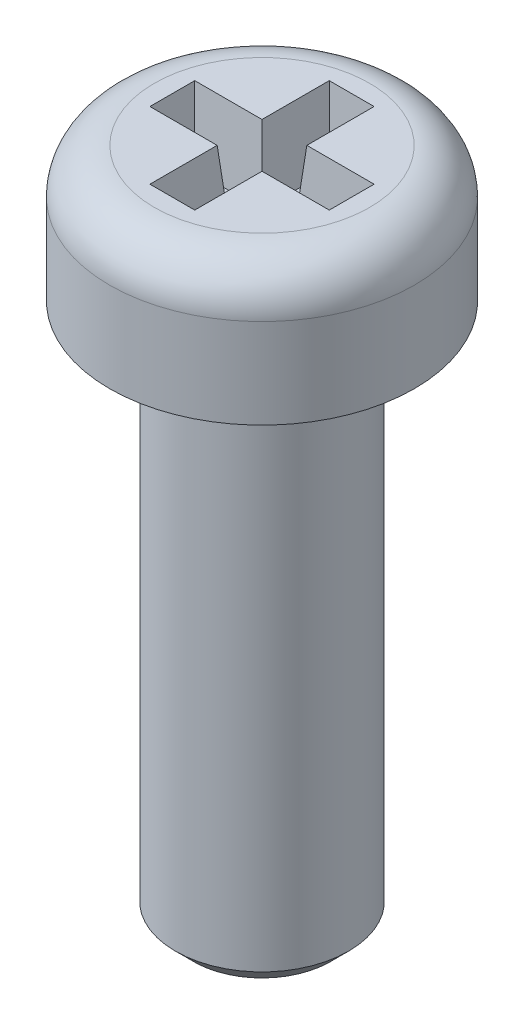
ISO-10303-21;
HEADER;
FILE_DESCRIPTION(('STEP AP214'),'2;1');
FILE_NAME('part.step','',(''),(''),'','','');
FILE_SCHEMA(('AUTOMOTIVE_DESIGN { 1 0 10303 214 1 1 1 1 }'));
ENDSEC;
DATA;
#1=APPLICATION_CONTEXT('core data for automotive mechanical design processes');
#2=APPLICATION_PROTOCOL_DEFINITION('international standard','automotive_design',2000,#1);
#3=PRODUCT_CONTEXT('',#1,'mechanical');
#4=PRODUCT('Part','Part','',(#3));
#5=PRODUCT_RELATED_PRODUCT_CATEGORY('part','',(#4));
#6=PRODUCT_DEFINITION_FORMATION('','',#4);
#7=PRODUCT_DEFINITION_CONTEXT('part definition',#1,'design');
#8=PRODUCT_DEFINITION('design','',#6,#7);
#9=PRODUCT_DEFINITION_SHAPE('','',#8);
#10=(LENGTH_UNIT() NAMED_UNIT(*) SI_UNIT(.MILLI.,.METRE.));
#11=(NAMED_UNIT(*) PLANE_ANGLE_UNIT() SI_UNIT($,.RADIAN.));
#12=(NAMED_UNIT(*) SI_UNIT($,.STERADIAN.) SOLID_ANGLE_UNIT());
#13=UNCERTAINTY_MEASURE_WITH_UNIT(LENGTH_MEASURE(1.E-05),#10,'distance_accuracy_value','');
#14=(GEOMETRIC_REPRESENTATION_CONTEXT(3) GLOBAL_UNCERTAINTY_ASSIGNED_CONTEXT((#13)) GLOBAL_UNIT_ASSIGNED_CONTEXT((#10,
#11,#12)) REPRESENTATION_CONTEXT('',''));
#15=CARTESIAN_POINT('',(0.,0.,0.));
#16=DIRECTION('',(0.,0.,1.));
#17=DIRECTION('',(1.,0.,0.));
#18=AXIS2_PLACEMENT_3D('',#15,#16,#17);
#19=CARTESIAN_POINT('',(0.,1.5,0.));
#20=DIRECTION('',(0.,-1.,0.));
#21=DIRECTION('',(0.,0.,-1.));
#22=AXIS2_PLACEMENT_3D('',#19,#20,#21);
#23=CYLINDRICAL_SURFACE('',#22,1.7);
#24=CARTESIAN_POINT('',(0.,1.,0.));
#25=DIRECTION('',(0.,1.,0.));
#26=DIRECTION('',(0.,0.,1.));
#27=AXIS2_PLACEMENT_3D('',#24,#25,#26);
#28=CIRCLE('',#27,1.7);
#29=CARTESIAN_POINT('',(0.,1.,1.7));
#30=VERTEX_POINT('',#29);
#31=EDGE_CURVE('E12',#30,#30,#28,.F.);
#32=ORIENTED_EDGE('',*,*,#31,.T.);
#33=EDGE_LOOP('',(#32));
#34=FACE_BOUND('',#33,.T.);
#35=CARTESIAN_POINT('',(0.,0.,0.));
#36=DIRECTION('',(0.,1.,0.));
#37=DIRECTION('',(0.,0.,1.));
#38=AXIS2_PLACEMENT_3D('',#35,#36,#37);
#39=CIRCLE('',#38,1.7);
#40=CARTESIAN_POINT('',(0.,0.,1.7));
#41=VERTEX_POINT('',#40);
#42=EDGE_CURVE('E278',#41,#41,#39,.T.);
#43=ORIENTED_EDGE('',*,*,#42,.T.);
#44=EDGE_LOOP('',(#43));
#45=FACE_BOUND('',#44,.T.);
#46=ADVANCED_FACE('F72',(#34,#45),#23,.T.);
#47=CARTESIAN_POINT('',(0.,1.5,0.));
#48=DIRECTION('',(0.,1.,0.));
#49=DIRECTION('',(0.,0.,1.));
#50=AXIS2_PLACEMENT_3D('',#47,#48,#49);
#51=PLANE('',#50);
#52=CARTESIAN_POINT('',(0.,1.5,0.));
#53=DIRECTION('',(0.,1.,0.));
#54=DIRECTION('',(0.,0.,1.));
#55=AXIS2_PLACEMENT_3D('',#52,#53,#54);
#56=CIRCLE('',#55,1.2);
#57=CARTESIAN_POINT('',(0.,1.5,1.2));
#58=VERTEX_POINT('',#57);
#59=EDGE_CURVE('E81',#58,#58,#56,.T.);
#60=ORIENTED_EDGE('',*,*,#59,.T.);
#61=EDGE_LOOP('',(#60));
#62=FACE_BOUND('',#61,.T.);
#63=DIRECTION('',(1.,0.,0.));
#64=VECTOR('',#63,1.);
#65=CARTESIAN_POINT('',(-1.,1.5,0.25));
#66=LINE('',#65,#64);
#67=CARTESIAN_POINT('',(-1.,1.5,0.25));
#68=VERTEX_POINT('',#67);
#69=CARTESIAN_POINT('',(-0.25,1.5,0.25));
#70=VERTEX_POINT('',#69);
#71=EDGE_CURVE('E205',#68,#70,#66,.T.);
#72=ORIENTED_EDGE('',*,*,#71,.F.);
#73=DIRECTION('',(0.,0.,-1.));
#74=VECTOR('',#73,1.);
#75=CARTESIAN_POINT('',(-1.,1.5,0.25));
#76=LINE('',#75,#74);
#77=CARTESIAN_POINT('',(-1.,1.5,-0.25));
#78=VERTEX_POINT('',#77);
#79=EDGE_CURVE('E219',#68,#78,#76,.T.);
#80=ORIENTED_EDGE('',*,*,#79,.T.);
#81=DIRECTION('',(1.,0.,0.));
#82=VECTOR('',#81,1.);
#83=CARTESIAN_POINT('',(-1.,1.5,-0.25));
#84=LINE('',#83,#82);
#85=CARTESIAN_POINT('',(-0.25,1.5,-0.25));
#86=VERTEX_POINT('',#85);
#87=EDGE_CURVE('E213',#78,#86,#84,.T.);
#88=ORIENTED_EDGE('',*,*,#87,.T.);
#89=DIRECTION('',(0.,0.,-1.));
#90=VECTOR('',#89,1.);
#91=CARTESIAN_POINT('',(-0.25,1.5,1.));
#92=LINE('',#91,#90);
#93=CARTESIAN_POINT('',(-0.25,1.5,-1.));
#94=VERTEX_POINT('',#93);
#95=EDGE_CURVE('E265',#86,#94,#92,.T.);
#96=ORIENTED_EDGE('',*,*,#95,.T.);
#97=DIRECTION('',(1.,0.,0.));
#98=VECTOR('',#97,1.);
#99=CARTESIAN_POINT('',(-0.25,1.5,-1.));
#100=LINE('',#99,#98);
#101=CARTESIAN_POINT('',(0.25,1.5,-1.));
#102=VERTEX_POINT('',#101);
#103=EDGE_CURVE('E262',#94,#102,#100,.T.);
#104=ORIENTED_EDGE('',*,*,#103,.T.);
#105=DIRECTION('',(0.,0.,-1.));
#106=VECTOR('',#105,1.);
#107=CARTESIAN_POINT('',(0.25,1.5,1.));
#108=LINE('',#107,#106);
#109=CARTESIAN_POINT('',(0.25,1.5,-0.25));
#110=VERTEX_POINT('',#109);
#111=EDGE_CURVE('E211',#110,#102,#108,.T.);
#112=ORIENTED_EDGE('',*,*,#111,.F.);
#113=CARTESIAN_POINT('',(1.,1.5,-0.25));
#114=VERTEX_POINT('',#113);
#115=EDGE_CURVE('E192',#110,#114,#84,.T.);
#116=ORIENTED_EDGE('',*,*,#115,.T.);
#117=DIRECTION('',(0.,0.,1.));
#118=VECTOR('',#117,1.);
#119=CARTESIAN_POINT('',(1.,1.5,-0.25));
#120=LINE('',#119,#118);
#121=CARTESIAN_POINT('',(1.,1.5,0.25));
#122=VERTEX_POINT('',#121);
#123=EDGE_CURVE('E200',#114,#122,#120,.T.);
#124=ORIENTED_EDGE('',*,*,#123,.T.);
#125=CARTESIAN_POINT('',(0.25,1.5,0.25));
#126=VERTEX_POINT('',#125);
#127=EDGE_CURVE('E595',#126,#122,#66,.T.);
#128=ORIENTED_EDGE('',*,*,#127,.F.);
#129=CARTESIAN_POINT('',(0.25,1.5,1.));
#130=VERTEX_POINT('',#129);
#131=EDGE_CURVE('E258',#130,#126,#108,.T.);
#132=ORIENTED_EDGE('',*,*,#131,.F.);
#133=DIRECTION('',(-1.,0.,0.));
#134=VECTOR('',#133,1.);
#135=CARTESIAN_POINT('',(0.25,1.5,1.));
#136=LINE('',#135,#134);
#137=CARTESIAN_POINT('',(-0.25,1.5,1.));
#138=VERTEX_POINT('',#137);
#139=EDGE_CURVE('E270',#130,#138,#136,.T.);
#140=ORIENTED_EDGE('',*,*,#139,.T.);
#141=EDGE_CURVE('E266',#138,#70,#92,.T.);
#142=ORIENTED_EDGE('',*,*,#141,.T.);
#143=EDGE_LOOP('',(#72,#80,#88,#96,#104,#112,#116,#124,#128,#132,#140,#142));
#144=FACE_BOUND('',#143,.T.);
#145=ADVANCED_FACE('F209',(#62,#144),#51,.T.);
#146=CARTESIAN_POINT('',(0.,0.,0.));
#147=DIRECTION('',(0.,1.,0.));
#148=DIRECTION('',(0.,0.,1.));
#149=AXIS2_PLACEMENT_3D('',#146,#147,#148);
#150=PLANE('',#149);
#151=CARTESIAN_POINT('',(0.,0.,0.));
#152=DIRECTION('',(0.,-1.,0.));
#153=DIRECTION('',(0.,0.,-1.));
#154=AXIS2_PLACEMENT_3D('',#151,#152,#153);
#155=CIRCLE('',#154,0.965);
#156=CARTESIAN_POINT('',(0.,0.,-0.965));
#157=VERTEX_POINT('',#156);
#158=EDGE_CURVE('E304',#157,#157,#155,.T.);
#159=ORIENTED_EDGE('',*,*,#158,.F.);
#160=EDGE_LOOP('',(#159));
#161=FACE_BOUND('',#160,.T.);
#162=ORIENTED_EDGE('',*,*,#42,.F.);
#163=EDGE_LOOP('',(#162));
#164=FACE_BOUND('',#163,.T.);
#165=ADVANCED_FACE('F336',(#161,#164),#150,.F.);
#166=CARTESIAN_POINT('',(0.,-6.,0.));
#167=DIRECTION('',(0.,1.,0.));
#168=DIRECTION('',(0.,0.,1.));
#169=AXIS2_PLACEMENT_3D('',#166,#167,#168);
#170=CYLINDRICAL_SURFACE('',#169,0.965);
#171=CARTESIAN_POINT('',(0.,-5.8,0.));
#172=DIRECTION('',(0.,-1.,0.));
#173=DIRECTION('',(0.,0.,-1.));
#174=AXIS2_PLACEMENT_3D('',#171,#172,#173);
#175=CIRCLE('',#174,0.965);
#176=CARTESIAN_POINT('',(0.,-5.8,-0.965));
#177=VERTEX_POINT('',#176);
#178=EDGE_CURVE('E315',#177,#177,#175,.F.);
#179=ORIENTED_EDGE('',*,*,#178,.T.);
#180=EDGE_LOOP('',(#179));
#181=FACE_BOUND('',#180,.T.);
#182=ORIENTED_EDGE('',*,*,#158,.T.);
#183=EDGE_LOOP('',(#182));
#184=FACE_BOUND('',#183,.T.);
#185=ADVANCED_FACE('F356',(#181,#184),#170,.T.);
#186=CARTESIAN_POINT('',(0.,-6.,0.));
#187=DIRECTION('',(0.,-1.,0.));
#188=DIRECTION('',(0.,0.,-1.));
#189=AXIS2_PLACEMENT_3D('',#186,#187,#188);
#190=PLANE('',#189);
#191=CARTESIAN_POINT('',(0.,-6.,0.));
#192=DIRECTION('',(0.,-1.,0.));
#193=DIRECTION('',(0.,0.,-1.));
#194=AXIS2_PLACEMENT_3D('',#191,#192,#193);
#195=CIRCLE('',#194,0.765000000000001);
#196=CARTESIAN_POINT('',(0.,-6.,-0.765000000000001));
#197=VERTEX_POINT('',#196);
#198=EDGE_CURVE('E308',#197,#197,#195,.T.);
#199=ORIENTED_EDGE('',*,*,#198,.T.);
#200=EDGE_LOOP('',(#199));
#201=FACE_BOUND('',#200,.T.);
#202=ADVANCED_FACE('F346',(#201),#190,.T.);
#203=CARTESIAN_POINT('',(0.,-6.,0.));
#204=DIRECTION('',(0.,1.,0.));
#205=DIRECTION('',(0.,0.,1.));
#206=AXIS2_PLACEMENT_3D('',#203,#204,#205);
#207=CONICAL_SURFACE('',#206,0.765000000000001,0.785398163397444);
#208=ORIENTED_EDGE('',*,*,#178,.F.);
#209=EDGE_LOOP('',(#208));
#210=FACE_BOUND('',#209,.T.);
#211=ORIENTED_EDGE('',*,*,#198,.F.);
#212=EDGE_LOOP('',(#211));
#213=FACE_BOUND('',#212,.T.);
#214=ADVANCED_FACE('F341',(#210,#213),#207,.T.);
#215=CARTESIAN_POINT('',(0.25,1.5,1.));
#216=DIRECTION('',(0.996194698091746,-0.0871557427476584,0.));
#217=DIRECTION('',(0.0871557427476584,0.996194698091746,0.));
#218=AXIS2_PLACEMENT_3D('',#215,#216,#217);
#219=PLANE('',#218);
#220=ORIENTED_EDGE('',*,*,#111,.T.);
#221=DIRECTION('',(-0.0868265938642478,-0.992432509138967,0.0868265938642478));
#222=VECTOR('',#221,1.);
#223=CARTESIAN_POINT('',(0.246230571298966,1.45691523279566,-0.996230571298967));
#224=LINE('',#223,#222);
#225=CARTESIAN_POINT('',(0.18000906917926,0.7,-0.930009069179261));
#226=VERTEX_POINT('',#225);
#227=EDGE_CURVE('E280',#226,#102,#224,.F.);
#228=ORIENTED_EDGE('',*,*,#227,.F.);
#229=DIRECTION('',(0.,0.,-1.));
#230=VECTOR('',#229,1.);
#231=CARTESIAN_POINT('',(0.180009069179261,0.7,1.));
#232=LINE('',#231,#230);
#233=CARTESIAN_POINT('',(0.180009069179261,0.7,-0.180009069179261));
#234=VERTEX_POINT('',#233);
#235=EDGE_CURVE('E274',#234,#226,#232,.T.);
#236=ORIENTED_EDGE('',*,*,#235,.F.);
#237=DIRECTION('',(0.0868265938642478,0.992432509138967,-0.0868265938642478));
#238=VECTOR('',#237,1.);
#239=CARTESIAN_POINT('',(0.240576428247416,1.39228808198914,-0.240576428247416));
#240=LINE('',#239,#238);
#241=EDGE_CURVE('E250',#110,#234,#240,.F.);
#242=ORIENTED_EDGE('',*,*,#241,.F.);
#243=EDGE_LOOP('',(#220,#228,#236,#242));
#244=FACE_BOUND('',#243,.T.);
#245=ADVANCED_FACE('F345',(#244),#219,.F.);
#246=CARTESIAN_POINT('',(-0.25,1.5,1.));
#247=DIRECTION('',(-0.996194698091746,-0.0871557427476584,0.));
#248=DIRECTION('',(0.0871557427476584,-0.996194698091746,0.));
#249=AXIS2_PLACEMENT_3D('',#246,#247,#248);
#250=PLANE('',#249);
#251=DIRECTION('',(0.0868265938642478,-0.992432509138967,0.0868265938642478));
#252=VECTOR('',#251,1.);
#253=CARTESIAN_POINT('',(-0.240576428247416,1.39228808198914,-0.240576428247416));
#254=LINE('',#253,#252);
#255=CARTESIAN_POINT('',(-0.180009069179261,0.7,-0.180009069179261));
#256=VERTEX_POINT('',#255);
#257=EDGE_CURVE('E229',#86,#256,#254,.T.);
#258=ORIENTED_EDGE('',*,*,#257,.T.);
#259=DIRECTION('',(0.,0.,1.));
#260=VECTOR('',#259,1.);
#261=CARTESIAN_POINT('',(-0.180009069179261,0.7,1.));
#262=LINE('',#261,#260);
#263=CARTESIAN_POINT('',(-0.180009069179261,0.7,-0.930009069179261));
#264=VERTEX_POINT('',#263);
#265=EDGE_CURVE('E102',#256,#264,#262,.F.);
#266=ORIENTED_EDGE('',*,*,#265,.T.);
#267=DIRECTION('',(-0.0868265938642478,0.992432509138967,-0.0868265938642478));
#268=VECTOR('',#267,1.);
#269=CARTESIAN_POINT('',(-0.25,1.5,-1.));
#270=LINE('',#269,#268);
#271=EDGE_CURVE('E284',#264,#94,#270,.T.);
#272=ORIENTED_EDGE('',*,*,#271,.T.);
#273=ORIENTED_EDGE('',*,*,#95,.F.);
#274=EDGE_LOOP('',(#258,#266,#272,#273));
#275=FACE_BOUND('',#274,.T.);
#276=ADVANCED_FACE('F352',(#275),#250,.F.);
#277=DIRECTION('',(-0.0868265938642478,-0.992432509138967,-0.0868265938642478));
#278=VECTOR('',#277,1.);
#279=CARTESIAN_POINT('',(0.25565414305155,1.56462715080651,0.25565414305155));
#280=LINE('',#279,#278);
#281=CARTESIAN_POINT('',(0.180009069179261,0.7,0.18000906917926));
#282=VERTEX_POINT('',#281);
#283=EDGE_CURVE('E255',#126,#282,#280,.T.);
#284=ORIENTED_EDGE('',*,*,#283,.T.);
#285=CARTESIAN_POINT('',(0.180009069179261,0.7,0.930009069179261));
#286=VERTEX_POINT('',#285);
#287=EDGE_CURVE('E290',#286,#282,#232,.T.);
#288=ORIENTED_EDGE('',*,*,#287,.F.);
#289=DIRECTION('',(-0.0868265938642478,-0.992432509138967,-0.0868265938642478));
#290=VECTOR('',#289,1.);
#291=CARTESIAN_POINT('',(0.25,1.5,1.));
#292=LINE('',#291,#290);
#293=EDGE_CURVE('E275',#286,#130,#292,.F.);
#294=ORIENTED_EDGE('',*,*,#293,.T.);
#295=ORIENTED_EDGE('',*,*,#131,.T.);
#296=EDGE_LOOP('',(#284,#288,#294,#295));
#297=FACE_BOUND('',#296,.T.);
#298=ADVANCED_FACE('F355',(#297),#219,.F.);
#299=CARTESIAN_POINT('',(0.25,1.5,1.));
#300=DIRECTION('',(0.,-0.0871557427476584,0.996194698091746));
#301=DIRECTION('',(0.,-0.996194698091746,-0.0871557427476584));
#302=AXIS2_PLACEMENT_3D('',#299,#300,#301);
#303=PLANE('',#302);
#304=ORIENTED_EDGE('',*,*,#139,.F.);
#305=ORIENTED_EDGE('',*,*,#293,.F.);
#306=DIRECTION('',(1.,0.,0.));
#307=VECTOR('',#306,1.);
#308=CARTESIAN_POINT('',(0.25,0.7,0.930009069179261));
#309=LINE('',#308,#307);
#310=CARTESIAN_POINT('',(-0.180009069179261,0.7,0.930009069179261));
#311=VERTEX_POINT('',#310);
#312=EDGE_CURVE('E285',#286,#311,#309,.F.);
#313=ORIENTED_EDGE('',*,*,#312,.T.);
#314=DIRECTION('',(-0.0868265938642478,0.992432509138967,0.0868265938642478));
#315=VECTOR('',#314,1.);
#316=CARTESIAN_POINT('',(-0.25,1.5,1.));
#317=LINE('',#316,#315);
#318=EDGE_CURVE('E279',#311,#138,#317,.T.);
#319=ORIENTED_EDGE('',*,*,#318,.T.);
#320=EDGE_LOOP('',(#304,#305,#313,#319));
#321=FACE_BOUND('',#320,.T.);
#322=ADVANCED_FACE('F534',(#321),#303,.F.);
#323=ORIENTED_EDGE('',*,*,#141,.F.);
#324=ORIENTED_EDGE('',*,*,#318,.F.);
#325=CARTESIAN_POINT('',(-0.180009069179261,0.7,0.18000906917926));
#326=VERTEX_POINT('',#325);
#327=EDGE_CURVE('E297',#311,#326,#262,.F.);
#328=ORIENTED_EDGE('',*,*,#327,.T.);
#329=DIRECTION('',(-0.0868265938642478,0.992432509138967,0.0868265938642478));
#330=VECTOR('',#329,1.);
#331=CARTESIAN_POINT('',(-0.25565414305155,1.56462715080651,0.25565414305155));
#332=LINE('',#331,#330);
#333=EDGE_CURVE('E252',#70,#326,#332,.F.);
#334=ORIENTED_EDGE('',*,*,#333,.F.);
#335=EDGE_LOOP('',(#323,#324,#328,#334));
#336=FACE_BOUND('',#335,.T.);
#337=ADVANCED_FACE('F527',(#336),#250,.F.);
#338=CARTESIAN_POINT('',(-0.25,1.5,-1.));
#339=DIRECTION('',(0.,-0.0871557427476584,-0.996194698091746));
#340=DIRECTION('',(0.,0.996194698091746,-0.0871557427476584));
#341=AXIS2_PLACEMENT_3D('',#338,#339,#340);
#342=PLANE('',#341);
#343=ORIENTED_EDGE('',*,*,#103,.F.);
#344=ORIENTED_EDGE('',*,*,#271,.F.);
#345=DIRECTION('',(-1.,0.,0.));
#346=VECTOR('',#345,1.);
#347=CARTESIAN_POINT('',(-0.25,0.7,-0.930009069179261));
#348=LINE('',#347,#346);
#349=EDGE_CURVE('E294',#264,#226,#348,.F.);
#350=ORIENTED_EDGE('',*,*,#349,.T.);
#351=ORIENTED_EDGE('',*,*,#227,.T.);
#352=EDGE_LOOP('',(#343,#344,#350,#351));
#353=FACE_BOUND('',#352,.T.);
#354=ADVANCED_FACE('F437',(#353),#342,.F.);
#355=CARTESIAN_POINT('',(0.,0.7,0.));
#356=DIRECTION('',(0.,-1.,0.));
#357=DIRECTION('',(-1.,0.,0.));
#358=AXIS2_PLACEMENT_3D('',#355,#356,#357);
#359=PLANE('',#358);
#360=ORIENTED_EDGE('',*,*,#327,.F.);
#361=ORIENTED_EDGE('',*,*,#312,.F.);
#362=ORIENTED_EDGE('',*,*,#287,.T.);
#363=DIRECTION('',(1.,0.,0.));
#364=VECTOR('',#363,1.);
#365=CARTESIAN_POINT('',(-1.,0.7,0.180009069179261));
#366=LINE('',#365,#364);
#367=CARTESIAN_POINT('',(0.930009069179261,0.7,0.18000906917926));
#368=VERTEX_POINT('',#367);
#369=EDGE_CURVE('E225',#282,#368,#366,.T.);
#370=ORIENTED_EDGE('',*,*,#369,.T.);
#371=DIRECTION('',(0.,0.,-1.));
#372=VECTOR('',#371,1.);
#373=CARTESIAN_POINT('',(0.930009069179261,0.7,-0.25));
#374=LINE('',#373,#372);
#375=CARTESIAN_POINT('',(0.930009069179261,0.7,-0.180009069179261));
#376=VERTEX_POINT('',#375);
#377=EDGE_CURVE('E239',#376,#368,#374,.F.);
#378=ORIENTED_EDGE('',*,*,#377,.F.);
#379=DIRECTION('',(-1.,0.,0.));
#380=VECTOR('',#379,1.);
#381=CARTESIAN_POINT('',(-1.,0.7,-0.180009069179261));
#382=LINE('',#381,#380);
#383=EDGE_CURVE('E194',#234,#376,#382,.F.);
#384=ORIENTED_EDGE('',*,*,#383,.F.);
#385=ORIENTED_EDGE('',*,*,#235,.T.);
#386=ORIENTED_EDGE('',*,*,#349,.F.);
#387=ORIENTED_EDGE('',*,*,#265,.F.);
#388=CARTESIAN_POINT('',(-0.930009069179261,0.7,-0.180009069179261));
#389=VERTEX_POINT('',#388);
#390=EDGE_CURVE('E242',#389,#256,#382,.F.);
#391=ORIENTED_EDGE('',*,*,#390,.F.);
#392=DIRECTION('',(0.,0.,1.));
#393=VECTOR('',#392,1.);
#394=CARTESIAN_POINT('',(-0.930009069179261,0.7,0.25));
#395=LINE('',#394,#393);
#396=CARTESIAN_POINT('',(-0.930009069179261,0.7,0.180009069179261));
#397=VERTEX_POINT('',#396);
#398=EDGE_CURVE('E231',#397,#389,#395,.F.);
#399=ORIENTED_EDGE('',*,*,#398,.F.);
#400=EDGE_CURVE('E235',#397,#326,#366,.T.);
#401=ORIENTED_EDGE('',*,*,#400,.T.);
#402=EDGE_LOOP('',(#360,#361,#362,#370,#378,#384,#385,#386,#387,#391,#399,#401));
#403=FACE_BOUND('',#402,.T.);
#404=ADVANCED_FACE('F434',(#403),#359,.F.);
#405=CARTESIAN_POINT('',(-1.,1.5,0.25));
#406=DIRECTION('',(-0.996194698091746,-0.0871557427476584,0.));
#407=DIRECTION('',(0.0871557427476584,-0.996194698091746,0.));
#408=AXIS2_PLACEMENT_3D('',#405,#406,#407);
#409=PLANE('',#408);
#410=ORIENTED_EDGE('',*,*,#79,.F.);
#411=DIRECTION('',(0.0868265938642478,-0.992432509138967,-0.0868265938642478));
#412=VECTOR('',#411,1.);
#413=CARTESIAN_POINT('',(-1.,1.5,0.25));
#414=LINE('',#413,#412);
#415=EDGE_CURVE('E226',#397,#68,#414,.F.);
#416=ORIENTED_EDGE('',*,*,#415,.F.);
#417=ORIENTED_EDGE('',*,*,#398,.T.);
#418=DIRECTION('',(-0.0868265938642478,0.992432509138967,-0.0868265938642478));
#419=VECTOR('',#418,1.);
#420=CARTESIAN_POINT('',(-1.,1.5,-0.25));
#421=LINE('',#420,#419);
#422=EDGE_CURVE('E197',#389,#78,#421,.T.);
#423=ORIENTED_EDGE('',*,*,#422,.T.);
#424=EDGE_LOOP('',(#410,#416,#417,#423));
#425=FACE_BOUND('',#424,.T.);
#426=ADVANCED_FACE('F392',(#425),#409,.F.);
#427=CARTESIAN_POINT('',(-1.,1.5,-0.25));
#428=DIRECTION('',(0.,-0.0871557427476584,-0.996194698091746));
#429=DIRECTION('',(0.,0.996194698091746,-0.0871557427476584));
#430=AXIS2_PLACEMENT_3D('',#427,#428,#429);
#431=PLANE('',#430);
#432=ORIENTED_EDGE('',*,*,#87,.F.);
#433=ORIENTED_EDGE('',*,*,#422,.F.);
#434=ORIENTED_EDGE('',*,*,#390,.T.);
#435=ORIENTED_EDGE('',*,*,#257,.F.);
#436=EDGE_LOOP('',(#432,#433,#434,#435));
#437=FACE_BOUND('',#436,.T.);
#438=ADVANCED_FACE('F388',(#437),#431,.F.);
#439=CARTESIAN_POINT('',(-1.,1.5,0.25));
#440=DIRECTION('',(0.,-0.0871557427476584,0.996194698091746));
#441=DIRECTION('',(0.,-0.996194698091746,-0.0871557427476584));
#442=AXIS2_PLACEMENT_3D('',#439,#440,#441);
#443=PLANE('',#442);
#444=ORIENTED_EDGE('',*,*,#333,.T.);
#445=ORIENTED_EDGE('',*,*,#400,.F.);
#446=ORIENTED_EDGE('',*,*,#415,.T.);
#447=ORIENTED_EDGE('',*,*,#71,.T.);
#448=EDGE_LOOP('',(#444,#445,#446,#447));
#449=FACE_BOUND('',#448,.T.);
#450=ADVANCED_FACE('F391',(#449),#443,.F.);
#451=ORIENTED_EDGE('',*,*,#127,.T.);
#452=DIRECTION('',(-0.0868265938642478,-0.992432509138967,-0.0868265938642478));
#453=VECTOR('',#452,1.);
#454=CARTESIAN_POINT('',(0.996230571298967,1.45691523279566,0.246230571298966));
#455=LINE('',#454,#453);
#456=EDGE_CURVE('E91',#368,#122,#455,.F.);
#457=ORIENTED_EDGE('',*,*,#456,.F.);
#458=ORIENTED_EDGE('',*,*,#369,.F.);
#459=ORIENTED_EDGE('',*,*,#283,.F.);
#460=EDGE_LOOP('',(#451,#457,#458,#459));
#461=FACE_BOUND('',#460,.T.);
#462=ADVANCED_FACE('F412',(#461),#443,.F.);
#463=ORIENTED_EDGE('',*,*,#241,.T.);
#464=ORIENTED_EDGE('',*,*,#383,.T.);
#465=DIRECTION('',(0.0868265938642478,0.992432509138967,-0.0868265938642478));
#466=VECTOR('',#465,1.);
#467=CARTESIAN_POINT('',(1.,1.5,-0.25));
#468=LINE('',#467,#466);
#469=EDGE_CURVE('E188',#376,#114,#468,.T.);
#470=ORIENTED_EDGE('',*,*,#469,.T.);
#471=ORIENTED_EDGE('',*,*,#115,.F.);
#472=EDGE_LOOP('',(#463,#464,#470,#471));
#473=FACE_BOUND('',#472,.T.);
#474=ADVANCED_FACE('F190',(#473),#431,.F.);
#475=CARTESIAN_POINT('',(1.,1.5,-0.25));
#476=DIRECTION('',(0.996194698091746,-0.0871557427476584,0.));
#477=DIRECTION('',(0.0871557427476584,0.996194698091746,0.));
#478=AXIS2_PLACEMENT_3D('',#475,#476,#477);
#479=PLANE('',#478);
#480=ORIENTED_EDGE('',*,*,#123,.F.);
#481=ORIENTED_EDGE('',*,*,#469,.F.);
#482=ORIENTED_EDGE('',*,*,#377,.T.);
#483=ORIENTED_EDGE('',*,*,#456,.T.);
#484=EDGE_LOOP('',(#480,#481,#482,#483));
#485=FACE_BOUND('',#484,.T.);
#486=ADVANCED_FACE('F201',(#485),#479,.F.);
#487=CARTESIAN_POINT('',(0.,1.,0.));
#488=DIRECTION('',(0.,1.,0.));
#489=DIRECTION('',(0.,0.,1.));
#490=AXIS2_PLACEMENT_3D('',#487,#488,#489);
#491=TOROIDAL_SURFACE('',#490,1.2,0.5);
#492=ORIENTED_EDGE('',*,*,#31,.F.);
#493=EDGE_LOOP('',(#492));
#494=FACE_BOUND('',#493,.T.);
#495=ORIENTED_EDGE('',*,*,#59,.F.);
#496=EDGE_LOOP('',(#495));
#497=FACE_BOUND('',#496,.T.);
#498=ADVANCED_FACE('F74',(#494,#497),#491,.T.);
#499=CLOSED_SHELL('',(#46,#145,#165,#185,#202,#214,#245,#276,#298,#322,#337,#354,#404,#426,#438,
#450,#462,#474,#486,#498));
#500=MANIFOLD_SOLID_BREP('B2',#499);
#501=ADVANCED_BREP_SHAPE_REPRESENTATION('',(#18,#500),#14);
#502=SHAPE_DEFINITION_REPRESENTATION(#9,#501);
ENDSEC;
END-ISO-10303-21;
